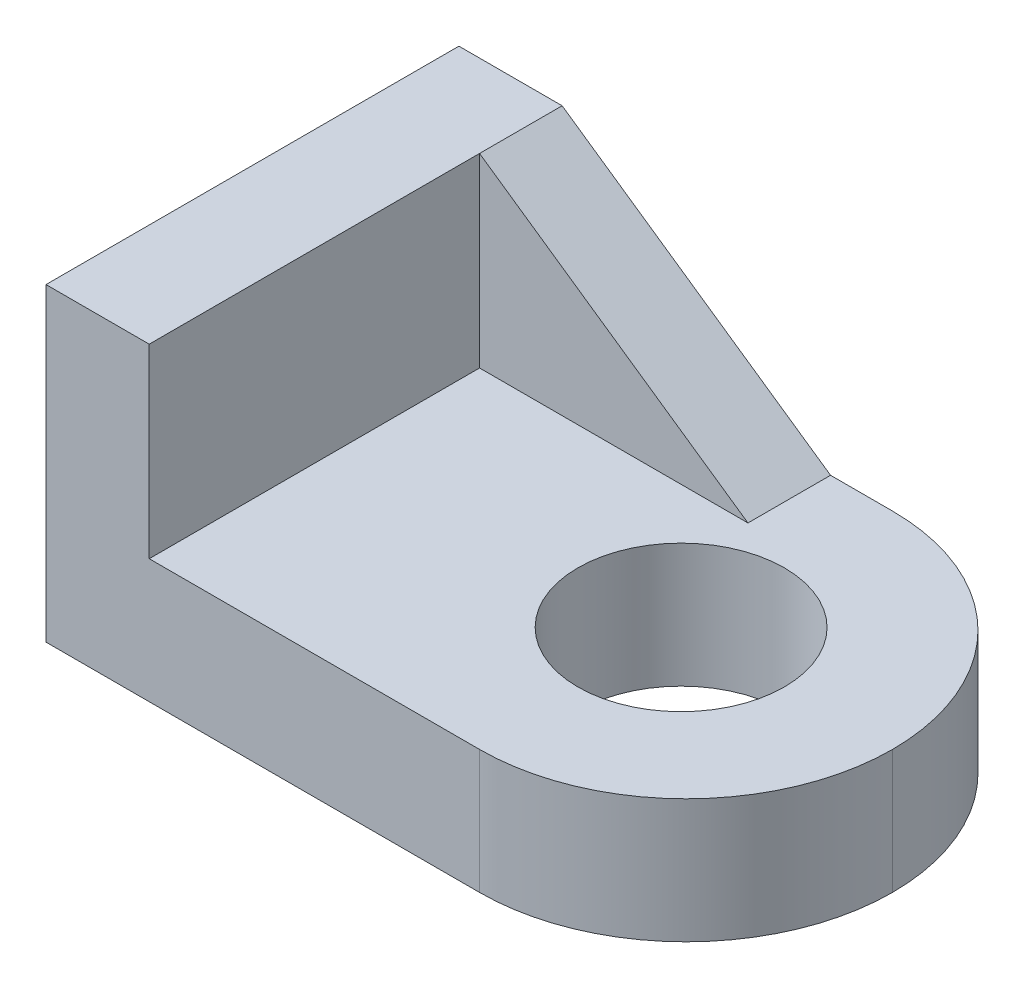
ISO-10303-21;
HEADER;
FILE_DESCRIPTION(('STEP AP214'),'2;1');
FILE_NAME('part.step','',(''),(''),'','','');
FILE_SCHEMA(('AUTOMOTIVE_DESIGN { 1 0 10303 214 1 1 1 1 }'));
ENDSEC;
DATA;
#1=APPLICATION_CONTEXT('core data for automotive mechanical design processes');
#2=APPLICATION_PROTOCOL_DEFINITION('international standard','automotive_design',2000,#1);
#3=PRODUCT_CONTEXT('',#1,'mechanical');
#4=PRODUCT('Part','Part','',(#3));
#5=PRODUCT_RELATED_PRODUCT_CATEGORY('part','',(#4));
#6=PRODUCT_DEFINITION_FORMATION('','',#4);
#7=PRODUCT_DEFINITION_CONTEXT('part definition',#1,'design');
#8=PRODUCT_DEFINITION('design','',#6,#7);
#9=PRODUCT_DEFINITION_SHAPE('','',#8);
#10=(LENGTH_UNIT() NAMED_UNIT(*) SI_UNIT(.MILLI.,.METRE.));
#11=(NAMED_UNIT(*) PLANE_ANGLE_UNIT() SI_UNIT($,.RADIAN.));
#12=(NAMED_UNIT(*) SI_UNIT($,.STERADIAN.) SOLID_ANGLE_UNIT());
#13=UNCERTAINTY_MEASURE_WITH_UNIT(LENGTH_MEASURE(1.E-05),#10,'distance_accuracy_value','');
#14=(GEOMETRIC_REPRESENTATION_CONTEXT(3) GLOBAL_UNCERTAINTY_ASSIGNED_CONTEXT((#13)) GLOBAL_UNIT_ASSIGNED_CONTEXT((#10,
#11,#12)) REPRESENTATION_CONTEXT('',''));
#15=CARTESIAN_POINT('',(0.,0.,0.));
#16=DIRECTION('',(0.,0.,1.));
#17=DIRECTION('',(1.,0.,0.));
#18=AXIS2_PLACEMENT_3D('',#15,#16,#17);
#19=CARTESIAN_POINT('',(62.,0.,20.));
#20=DIRECTION('',(0.,1.,0.));
#21=DIRECTION('',(0.,0.,1.));
#22=AXIS2_PLACEMENT_3D('',#19,#20,#21);
#23=PLANE('',#22);
#24=CARTESIAN_POINT('',(41.524228064176,0.,0.));
#25=DIRECTION('',(0.,1.,0.));
#26=DIRECTION('',(0.,0.,1.));
#27=AXIS2_PLACEMENT_3D('',#24,#25,#26);
#28=CIRCLE('',#27,10.);
#29=CARTESIAN_POINT('',(41.524228064176,0.,10.));
#30=VERTEX_POINT('',#29);
#31=EDGE_CURVE('E162',#30,#30,#28,.T.);
#32=ORIENTED_EDGE('',*,*,#31,.T.);
#33=EDGE_LOOP('',(#32));
#34=FACE_BOUND('',#33,.T.);
#35=DIRECTION('',(1.,0.,0.));
#36=VECTOR('',#35,1.);
#37=CARTESIAN_POINT('',(62.,0.,-20.));
#38=LINE('',#37,#36);
#39=CARTESIAN_POINT('',(0.,0.,-20.));
#40=VERTEX_POINT('',#39);
#41=CARTESIAN_POINT('',(42.,0.,-20.));
#42=VERTEX_POINT('',#41);
#43=EDGE_CURVE('E128',#40,#42,#38,.T.);
#44=ORIENTED_EDGE('',*,*,#43,.T.);
#45=CARTESIAN_POINT('',(42.,0.,0.));
#46=DIRECTION('',(0.,1.,0.));
#47=DIRECTION('',(0.,0.,1.));
#48=AXIS2_PLACEMENT_3D('',#45,#46,#47);
#49=CIRCLE('',#48,20.);
#50=CARTESIAN_POINT('',(62.,0.,0.));
#51=VERTEX_POINT('',#50);
#52=EDGE_CURVE('E42',#42,#51,#49,.F.);
#53=ORIENTED_EDGE('',*,*,#52,.T.);
#54=CARTESIAN_POINT('',(42.,0.,0.));
#55=DIRECTION('',(0.,1.,0.));
#56=DIRECTION('',(0.,0.,1.));
#57=AXIS2_PLACEMENT_3D('',#54,#55,#56);
#58=CIRCLE('',#57,20.);
#59=CARTESIAN_POINT('',(42.,0.,20.));
#60=VERTEX_POINT('',#59);
#61=EDGE_CURVE('E149',#51,#60,#58,.F.);
#62=ORIENTED_EDGE('',*,*,#61,.T.);
#63=DIRECTION('',(1.,0.,0.));
#64=VECTOR('',#63,1.);
#65=CARTESIAN_POINT('',(62.,0.,20.));
#66=LINE('',#65,#64);
#67=CARTESIAN_POINT('',(0.,0.,20.));
#68=VERTEX_POINT('',#67);
#69=EDGE_CURVE('E108',#68,#60,#66,.T.);
#70=ORIENTED_EDGE('',*,*,#69,.F.);
#71=DIRECTION('',(0.,0.,-1.));
#72=VECTOR('',#71,1.);
#73=CARTESIAN_POINT('',(0.,0.,20.));
#74=LINE('',#73,#72);
#75=EDGE_CURVE('E127',#68,#40,#74,.T.);
#76=ORIENTED_EDGE('',*,*,#75,.T.);
#77=EDGE_LOOP('',(#44,#53,#62,#70,#76));
#78=FACE_BOUND('',#77,.T.);
#79=ADVANCED_FACE('F33',(#34,#78),#23,.F.);
#80=CARTESIAN_POINT('',(10.,12.,20.));
#81=DIRECTION('',(0.,-1.,0.));
#82=DIRECTION('',(0.,0.,-1.));
#83=AXIS2_PLACEMENT_3D('',#80,#81,#82);
#84=PLANE('',#83);
#85=CARTESIAN_POINT('',(41.524228064176,12.,0.));
#86=DIRECTION('',(0.,1.,0.));
#87=DIRECTION('',(0.,0.,1.));
#88=AXIS2_PLACEMENT_3D('',#85,#86,#87);
#89=CIRCLE('',#88,10.);
#90=CARTESIAN_POINT('',(41.524228064176,12.,10.));
#91=VERTEX_POINT('',#90);
#92=EDGE_CURVE('E164',#91,#91,#89,.T.);
#93=ORIENTED_EDGE('',*,*,#92,.F.);
#94=EDGE_LOOP('',(#93));
#95=FACE_BOUND('',#94,.T.);
#96=DIRECTION('',(-1.,0.,0.));
#97=VECTOR('',#96,1.);
#98=CARTESIAN_POINT('',(10.,12.,-20.));
#99=LINE('',#98,#97);
#100=CARTESIAN_POINT('',(42.,12.,-20.));
#101=VERTEX_POINT('',#100);
#102=CARTESIAN_POINT('',(36.,12.,-20.));
#103=VERTEX_POINT('',#102);
#104=EDGE_CURVE('E131',#101,#103,#99,.T.);
#105=ORIENTED_EDGE('',*,*,#104,.T.);
#106=DIRECTION('',(0.,0.,-1.));
#107=VECTOR('',#106,1.);
#108=CARTESIAN_POINT('',(36.,12.,-12.));
#109=LINE('',#108,#107);
#110=CARTESIAN_POINT('',(36.,12.,-12.));
#111=VERTEX_POINT('',#110);
#112=EDGE_CURVE('E49',#111,#103,#109,.T.);
#113=ORIENTED_EDGE('',*,*,#112,.F.);
#114=DIRECTION('',(-1.,0.,0.));
#115=VECTOR('',#114,1.);
#116=CARTESIAN_POINT('',(36.,12.,-12.));
#117=LINE('',#116,#115);
#118=CARTESIAN_POINT('',(10.,12.,-12.));
#119=VERTEX_POINT('',#118);
#120=EDGE_CURVE('E54',#111,#119,#117,.T.);
#121=ORIENTED_EDGE('',*,*,#120,.T.);
#122=DIRECTION('',(0.,0.,-1.));
#123=VECTOR('',#122,1.);
#124=CARTESIAN_POINT('',(10.,12.,20.));
#125=LINE('',#124,#123);
#126=CARTESIAN_POINT('',(10.,12.,20.));
#127=VERTEX_POINT('',#126);
#128=EDGE_CURVE('E110',#127,#119,#125,.T.);
#129=ORIENTED_EDGE('',*,*,#128,.F.);
#130=DIRECTION('',(-1.,0.,0.));
#131=VECTOR('',#130,1.);
#132=CARTESIAN_POINT('',(10.,12.,20.));
#133=LINE('',#132,#131);
#134=CARTESIAN_POINT('',(42.,12.,20.));
#135=VERTEX_POINT('',#134);
#136=EDGE_CURVE('E100',#135,#127,#133,.T.);
#137=ORIENTED_EDGE('',*,*,#136,.F.);
#138=CARTESIAN_POINT('',(42.,12.,0.));
#139=DIRECTION('',(0.,-1.,0.));
#140=DIRECTION('',(0.,0.,-1.));
#141=AXIS2_PLACEMENT_3D('',#138,#139,#140);
#142=CIRCLE('',#141,20.);
#143=CARTESIAN_POINT('',(62.,12.,0.));
#144=VERTEX_POINT('',#143);
#145=EDGE_CURVE('E114',#135,#144,#142,.F.);
#146=ORIENTED_EDGE('',*,*,#145,.T.);
#147=CARTESIAN_POINT('',(42.,12.,0.));
#148=DIRECTION('',(0.,-1.,0.));
#149=DIRECTION('',(0.,0.,-1.));
#150=AXIS2_PLACEMENT_3D('',#147,#148,#149);
#151=CIRCLE('',#150,20.);
#152=EDGE_CURVE('E144',#144,#101,#151,.F.);
#153=ORIENTED_EDGE('',*,*,#152,.T.);
#154=EDGE_LOOP('',(#105,#113,#121,#129,#137,#146,#153));
#155=FACE_BOUND('',#154,.T.);
#156=ADVANCED_FACE('F111',(#95,#155),#84,.F.);
#157=CARTESIAN_POINT('',(10.,30.,20.));
#158=DIRECTION('',(-1.,0.,0.));
#159=DIRECTION('',(0.,-1.,0.));
#160=AXIS2_PLACEMENT_3D('',#157,#158,#159);
#161=PLANE('',#160);
#162=ORIENTED_EDGE('',*,*,#128,.T.);
#163=DIRECTION('',(0.,1.,0.));
#164=VECTOR('',#163,1.);
#165=CARTESIAN_POINT('',(10.,12.,-12.));
#166=LINE('',#165,#164);
#167=CARTESIAN_POINT('',(10.,30.,-12.));
#168=VERTEX_POINT('',#167);
#169=EDGE_CURVE('E191',#119,#168,#166,.T.);
#170=ORIENTED_EDGE('',*,*,#169,.T.);
#171=DIRECTION('',(0.,0.,-1.));
#172=VECTOR('',#171,1.);
#173=CARTESIAN_POINT('',(10.,30.,20.));
#174=LINE('',#173,#172);
#175=CARTESIAN_POINT('',(10.,30.,20.));
#176=VERTEX_POINT('',#175);
#177=EDGE_CURVE('E115',#176,#168,#174,.T.);
#178=ORIENTED_EDGE('',*,*,#177,.F.);
#179=DIRECTION('',(0.,1.,0.));
#180=VECTOR('',#179,1.);
#181=CARTESIAN_POINT('',(10.,30.,20.));
#182=LINE('',#181,#180);
#183=EDGE_CURVE('E104',#127,#176,#182,.T.);
#184=ORIENTED_EDGE('',*,*,#183,.F.);
#185=EDGE_LOOP('',(#162,#170,#178,#184));
#186=FACE_BOUND('',#185,.T.);
#187=ADVANCED_FACE('F117',(#186),#161,.F.);
#188=CARTESIAN_POINT('',(0.,30.,20.));
#189=DIRECTION('',(0.,-1.,0.));
#190=DIRECTION('',(0.,0.,-1.));
#191=AXIS2_PLACEMENT_3D('',#188,#189,#190);
#192=PLANE('',#191);
#193=DIRECTION('',(-1.,0.,0.));
#194=VECTOR('',#193,1.);
#195=CARTESIAN_POINT('',(0.,30.,-20.));
#196=LINE('',#195,#194);
#197=CARTESIAN_POINT('',(10.,30.,-20.));
#198=VERTEX_POINT('',#197);
#199=CARTESIAN_POINT('',(0.,30.,-20.));
#200=VERTEX_POINT('',#199);
#201=EDGE_CURVE('E133',#198,#200,#196,.T.);
#202=ORIENTED_EDGE('',*,*,#201,.T.);
#203=DIRECTION('',(0.,0.,-1.));
#204=VECTOR('',#203,1.);
#205=CARTESIAN_POINT('',(0.,30.,20.));
#206=LINE('',#205,#204);
#207=CARTESIAN_POINT('',(0.,30.,20.));
#208=VERTEX_POINT('',#207);
#209=EDGE_CURVE('E139',#208,#200,#206,.T.);
#210=ORIENTED_EDGE('',*,*,#209,.F.);
#211=DIRECTION('',(-1.,0.,0.));
#212=VECTOR('',#211,1.);
#213=CARTESIAN_POINT('',(0.,30.,20.));
#214=LINE('',#213,#212);
#215=EDGE_CURVE('E120',#176,#208,#214,.T.);
#216=ORIENTED_EDGE('',*,*,#215,.F.);
#217=ORIENTED_EDGE('',*,*,#177,.T.);
#218=DIRECTION('',(0.,0.,-1.));
#219=VECTOR('',#218,1.);
#220=CARTESIAN_POINT('',(10.,30.,-12.));
#221=LINE('',#220,#219);
#222=EDGE_CURVE('E171',#168,#198,#221,.T.);
#223=ORIENTED_EDGE('',*,*,#222,.T.);
#224=EDGE_LOOP('',(#202,#210,#216,#217,#223));
#225=FACE_BOUND('',#224,.T.);
#226=ADVANCED_FACE('F196',(#225),#192,.F.);
#227=CARTESIAN_POINT('',(0.,0.,20.));
#228=DIRECTION('',(1.,0.,0.));
#229=DIRECTION('',(0.,0.,-1.));
#230=AXIS2_PLACEMENT_3D('',#227,#228,#229);
#231=PLANE('',#230);
#232=DIRECTION('',(0.,-1.,0.));
#233=VECTOR('',#232,1.);
#234=CARTESIAN_POINT('',(0.,0.,-20.));
#235=LINE('',#234,#233);
#236=EDGE_CURVE('E135',#200,#40,#235,.T.);
#237=ORIENTED_EDGE('',*,*,#236,.T.);
#238=ORIENTED_EDGE('',*,*,#75,.F.);
#239=DIRECTION('',(0.,-1.,0.));
#240=VECTOR('',#239,1.);
#241=CARTESIAN_POINT('',(0.,0.,20.));
#242=LINE('',#241,#240);
#243=EDGE_CURVE('E122',#208,#68,#242,.T.);
#244=ORIENTED_EDGE('',*,*,#243,.F.);
#245=ORIENTED_EDGE('',*,*,#209,.T.);
#246=EDGE_LOOP('',(#237,#238,#244,#245));
#247=FACE_BOUND('',#246,.T.);
#248=ADVANCED_FACE('F228',(#247),#231,.F.);
#249=CARTESIAN_POINT('',(0.,0.,20.));
#250=DIRECTION('',(0.,0.,-1.));
#251=DIRECTION('',(-1.,0.,0.));
#252=AXIS2_PLACEMENT_3D('',#249,#250,#251);
#253=PLANE('',#252);
#254=ORIENTED_EDGE('',*,*,#69,.T.);
#255=DIRECTION('',(0.,1.,0.));
#256=VECTOR('',#255,1.);
#257=CARTESIAN_POINT('',(42.,0.,20.));
#258=LINE('',#257,#256);
#259=EDGE_CURVE('E11',#60,#135,#258,.T.);
#260=ORIENTED_EDGE('',*,*,#259,.T.);
#261=ORIENTED_EDGE('',*,*,#136,.T.);
#262=ORIENTED_EDGE('',*,*,#183,.T.);
#263=ORIENTED_EDGE('',*,*,#215,.T.);
#264=ORIENTED_EDGE('',*,*,#243,.T.);
#265=EDGE_LOOP('',(#254,#260,#261,#262,#263,#264));
#266=FACE_BOUND('',#265,.T.);
#267=ADVANCED_FACE('F102',(#266),#253,.F.);
#268=CARTESIAN_POINT('',(0.,0.,-20.));
#269=DIRECTION('',(0.,0.,-1.));
#270=DIRECTION('',(-1.,0.,0.));
#271=AXIS2_PLACEMENT_3D('',#268,#269,#270);
#272=PLANE('',#271);
#273=ORIENTED_EDGE('',*,*,#201,.F.);
#274=DIRECTION('',(0.822192191643779,-0.569209978830308,0.));
#275=VECTOR('',#274,1.);
#276=CARTESIAN_POINT('',(10.,30.,-20.));
#277=LINE('',#276,#275);
#278=EDGE_CURVE('E183',#198,#103,#277,.T.);
#279=ORIENTED_EDGE('',*,*,#278,.T.);
#280=ORIENTED_EDGE('',*,*,#104,.F.);
#281=DIRECTION('',(0.,1.,0.));
#282=VECTOR('',#281,1.);
#283=CARTESIAN_POINT('',(42.,0.,-20.));
#284=LINE('',#283,#282);
#285=EDGE_CURVE('E146',#101,#42,#284,.F.);
#286=ORIENTED_EDGE('',*,*,#285,.T.);
#287=ORIENTED_EDGE('',*,*,#43,.F.);
#288=ORIENTED_EDGE('',*,*,#236,.F.);
#289=EDGE_LOOP('',(#273,#279,#280,#286,#287,#288));
#290=FACE_BOUND('',#289,.T.);
#291=ADVANCED_FACE('F179',(#290),#272,.T.);
#292=CARTESIAN_POINT('',(42.,0.,0.));
#293=DIRECTION('',(0.,1.,0.));
#294=DIRECTION('',(0.,0.,1.));
#295=AXIS2_PLACEMENT_3D('',#292,#293,#294);
#296=CYLINDRICAL_SURFACE('',#295,20.);
#297=ORIENTED_EDGE('',*,*,#259,.F.);
#298=ORIENTED_EDGE('',*,*,#61,.F.);
#299=DIRECTION('',(0.,1.,0.));
#300=VECTOR('',#299,1.);
#301=CARTESIAN_POINT('',(62.,12.,0.));
#302=LINE('',#301,#300);
#303=EDGE_CURVE('E37',#144,#51,#302,.F.);
#304=ORIENTED_EDGE('',*,*,#303,.F.);
#305=ORIENTED_EDGE('',*,*,#145,.F.);
#306=EDGE_LOOP('',(#297,#298,#304,#305));
#307=FACE_BOUND('',#306,.T.);
#308=ADVANCED_FACE('F35',(#307),#296,.T.);
#309=CARTESIAN_POINT('',(42.,12.,0.));
#310=DIRECTION('',(0.,-1.,0.));
#311=DIRECTION('',(0.,0.,-1.));
#312=AXIS2_PLACEMENT_3D('',#309,#310,#311);
#313=CYLINDRICAL_SURFACE('',#312,20.);
#314=ORIENTED_EDGE('',*,*,#52,.F.);
#315=ORIENTED_EDGE('',*,*,#285,.F.);
#316=ORIENTED_EDGE('',*,*,#152,.F.);
#317=ORIENTED_EDGE('',*,*,#303,.T.);
#318=EDGE_LOOP('',(#314,#315,#316,#317));
#319=FACE_BOUND('',#318,.T.);
#320=ADVANCED_FACE('F161',(#319),#313,.T.);
#321=CARTESIAN_POINT('',(41.524228064176,0.,0.));
#322=DIRECTION('',(0.,1.,0.));
#323=DIRECTION('',(0.,0.,1.));
#324=AXIS2_PLACEMENT_3D('',#321,#322,#323);
#325=CYLINDRICAL_SURFACE('',#324,10.);
#326=ORIENTED_EDGE('',*,*,#31,.F.);
#327=EDGE_LOOP('',(#326));
#328=FACE_BOUND('',#327,.T.);
#329=ORIENTED_EDGE('',*,*,#92,.T.);
#330=EDGE_LOOP('',(#329));
#331=FACE_BOUND('',#330,.T.);
#332=ADVANCED_FACE('F204',(#328,#331),#325,.F.);
#333=CARTESIAN_POINT('',(10.,30.,-12.));
#334=DIRECTION('',(0.569209978830308,0.822192191643779,0.));
#335=DIRECTION('',(-0.822192191643779,0.569209978830308,0.));
#336=AXIS2_PLACEMENT_3D('',#333,#334,#335);
#337=PLANE('',#336);
#338=ORIENTED_EDGE('',*,*,#278,.F.);
#339=ORIENTED_EDGE('',*,*,#222,.F.);
#340=DIRECTION('',(0.822192191643779,-0.569209978830308,0.));
#341=VECTOR('',#340,1.);
#342=CARTESIAN_POINT('',(10.,30.,-12.));
#343=LINE('',#342,#341);
#344=EDGE_CURVE('E188',#168,#111,#343,.T.);
#345=ORIENTED_EDGE('',*,*,#344,.T.);
#346=ORIENTED_EDGE('',*,*,#112,.T.);
#347=EDGE_LOOP('',(#338,#339,#345,#346));
#348=FACE_BOUND('',#347,.T.);
#349=ADVANCED_FACE('F185',(#348),#337,.T.);
#350=CARTESIAN_POINT('',(0.,0.,-12.));
#351=DIRECTION('',(0.,0.,1.));
#352=DIRECTION('',(1.,0.,0.));
#353=AXIS2_PLACEMENT_3D('',#350,#351,#352);
#354=PLANE('',#353);
#355=ORIENTED_EDGE('',*,*,#169,.F.);
#356=ORIENTED_EDGE('',*,*,#120,.F.);
#357=ORIENTED_EDGE('',*,*,#344,.F.);
#358=EDGE_LOOP('',(#355,#356,#357));
#359=FACE_BOUND('',#358,.T.);
#360=ADVANCED_FACE('F198',(#359),#354,.T.);
#361=CLOSED_SHELL('',(#79,#156,#187,#226,#248,#267,#291,#308,#320,#332,#349,#360));
#362=MANIFOLD_SOLID_BREP('B2',#361);
#363=ADVANCED_BREP_SHAPE_REPRESENTATION('',(#18,#362),#14);
#364=SHAPE_DEFINITION_REPRESENTATION(#9,#363);
ENDSEC;
END-ISO-10303-21;
